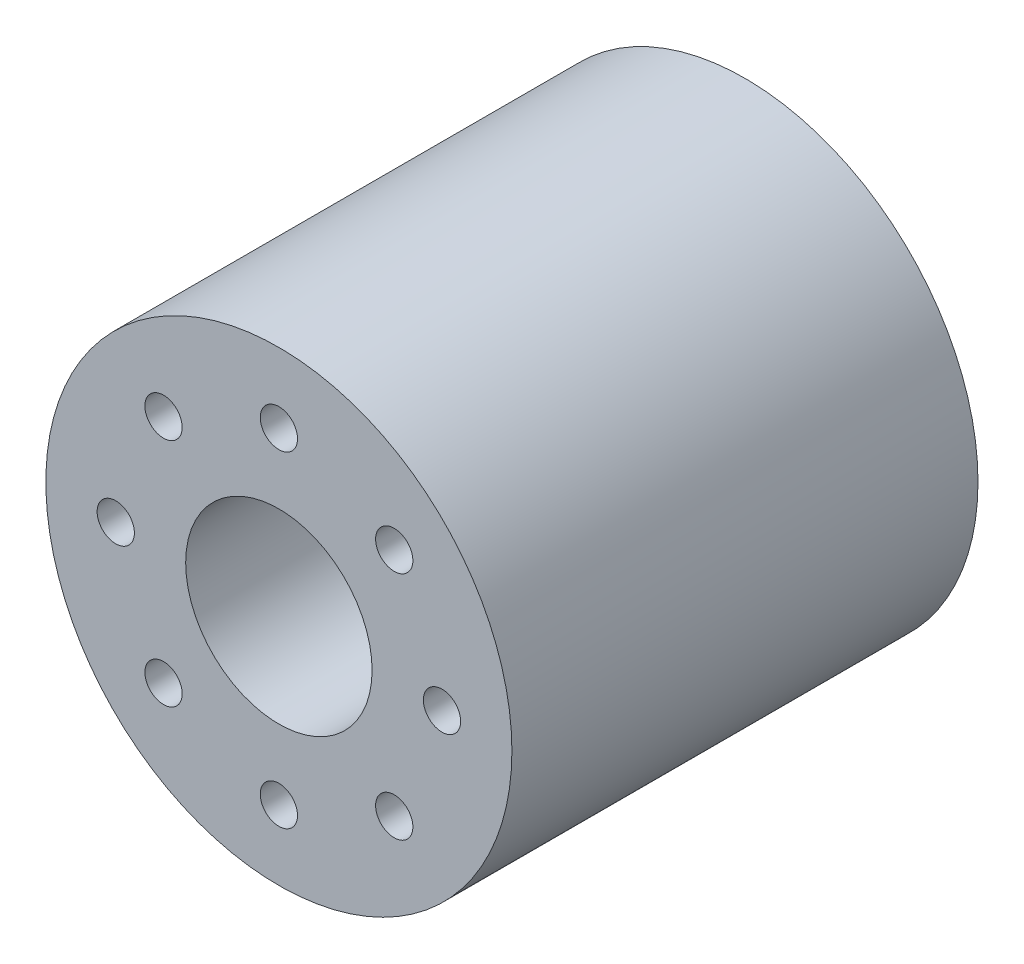
ISO-10303-21;
HEADER;
FILE_DESCRIPTION(('STEP AP214'),'2;1');
FILE_NAME('part.step','',(''),(''),'','','');
FILE_SCHEMA(('AUTOMOTIVE_DESIGN { 1 0 10303 214 1 1 1 1 }'));
ENDSEC;
DATA;
#1=APPLICATION_CONTEXT('core data for automotive mechanical design processes');
#2=APPLICATION_PROTOCOL_DEFINITION('international standard','automotive_design',2000,#1);
#3=PRODUCT_CONTEXT('',#1,'mechanical');
#4=PRODUCT('Part','Part','',(#3));
#5=PRODUCT_RELATED_PRODUCT_CATEGORY('part','',(#4));
#6=PRODUCT_DEFINITION_FORMATION('','',#4);
#7=PRODUCT_DEFINITION_CONTEXT('part definition',#1,'design');
#8=PRODUCT_DEFINITION('design','',#6,#7);
#9=PRODUCT_DEFINITION_SHAPE('','',#8);
#10=(LENGTH_UNIT() NAMED_UNIT(*) SI_UNIT(.MILLI.,.METRE.));
#11=(NAMED_UNIT(*) PLANE_ANGLE_UNIT() SI_UNIT($,.RADIAN.));
#12=(NAMED_UNIT(*) SI_UNIT($,.STERADIAN.) SOLID_ANGLE_UNIT());
#13=UNCERTAINTY_MEASURE_WITH_UNIT(LENGTH_MEASURE(1.E-05),#10,'distance_accuracy_value','');
#14=(GEOMETRIC_REPRESENTATION_CONTEXT(3) GLOBAL_UNCERTAINTY_ASSIGNED_CONTEXT((#13)) GLOBAL_UNIT_ASSIGNED_CONTEXT((#10,
#11,#12)) REPRESENTATION_CONTEXT('',''));
#15=CARTESIAN_POINT('',(0.,0.,0.));
#16=DIRECTION('',(0.,0.,1.));
#17=DIRECTION('',(1.,0.,0.));
#18=AXIS2_PLACEMENT_3D('',#15,#16,#17);
#19=CARTESIAN_POINT('',(0.,0.,25.));
#20=DIRECTION('',(0.,0.,1.));
#21=DIRECTION('',(1.,0.,0.));
#22=AXIS2_PLACEMENT_3D('',#19,#20,#21);
#23=PLANE('',#22);
#24=CARTESIAN_POINT('',(0.,8.75,25.));
#25=DIRECTION('',(0.,0.,1.));
#26=DIRECTION('',(1.,0.,0.));
#27=AXIS2_PLACEMENT_3D('',#24,#25,#26);
#28=CIRCLE('',#27,1.);
#29=CARTESIAN_POINT('',(1.,8.75,25.));
#30=VERTEX_POINT('',#29);
#31=EDGE_CURVE('E92',#30,#30,#28,.T.);
#32=ORIENTED_EDGE('',*,*,#31,.F.);
#33=EDGE_LOOP('',(#32));
#34=FACE_BOUND('',#33,.T.);
#35=CARTESIAN_POINT('',(6.1871843353824,6.18718433538255,25.));
#36=DIRECTION('',(0.,0.,1.));
#37=DIRECTION('',(1.,0.,0.));
#38=AXIS2_PLACEMENT_3D('',#35,#36,#37);
#39=CIRCLE('',#38,1.00000000000004);
#40=CARTESIAN_POINT('',(7.18718433538244,6.18718433538255,25.));
#41=VERTEX_POINT('',#40);
#42=EDGE_CURVE('E86',#41,#41,#39,.T.);
#43=ORIENTED_EDGE('',*,*,#42,.F.);
#44=EDGE_LOOP('',(#43));
#45=FACE_BOUND('',#44,.T.);
#46=CARTESIAN_POINT('',(8.75000000000037,3.71427587350172E-13,25.));
#47=DIRECTION('',(0.,0.,1.));
#48=DIRECTION('',(1.,0.,0.));
#49=AXIS2_PLACEMENT_3D('',#46,#47,#48);
#50=CIRCLE('',#49,1.00000000000028);
#51=CARTESIAN_POINT('',(9.75000000000065,3.71427587350172E-13,25.));
#52=VERTEX_POINT('',#51);
#53=EDGE_CURVE('E80',#52,#52,#50,.T.);
#54=ORIENTED_EDGE('',*,*,#53,.F.);
#55=EDGE_LOOP('',(#54));
#56=FACE_BOUND('',#55,.T.);
#57=CARTESIAN_POINT('',(6.18718433538292,-6.18718433538203,25.));
#58=DIRECTION('',(0.,0.,1.));
#59=DIRECTION('',(1.,0.,0.));
#60=AXIS2_PLACEMENT_3D('',#57,#58,#59);
#61=CIRCLE('',#60,1.00000000000057);
#62=CARTESIAN_POINT('',(7.1871843353835,-6.18718433538203,25.));
#63=VERTEX_POINT('',#62);
#64=EDGE_CURVE('E74',#63,#63,#61,.T.);
#65=ORIENTED_EDGE('',*,*,#64,.F.);
#66=EDGE_LOOP('',(#65));
#67=FACE_BOUND('',#66,.T.);
#68=CARTESIAN_POINT('',(7.42855174700344E-13,-8.75,25.));
#69=DIRECTION('',(0.,0.,1.));
#70=DIRECTION('',(1.,0.,0.));
#71=AXIS2_PLACEMENT_3D('',#68,#69,#70);
#72=CIRCLE('',#71,1.00000000000077);
#73=CARTESIAN_POINT('',(1.00000000000151,-8.75,25.));
#74=VERTEX_POINT('',#73);
#75=EDGE_CURVE('E68',#74,#74,#72,.T.);
#76=ORIENTED_EDGE('',*,*,#75,.F.);
#77=EDGE_LOOP('',(#76));
#78=FACE_BOUND('',#77,.T.);
#79=CARTESIAN_POINT('',(-6.18718433538166,-6.18718433538255,25.));
#80=DIRECTION('',(0.,0.,1.));
#81=DIRECTION('',(1.,0.,0.));
#82=AXIS2_PLACEMENT_3D('',#79,#80,#81);
#83=CIRCLE('',#82,1.00000000000076);
#84=CARTESIAN_POINT('',(-5.1871843353809,-6.18718433538255,25.));
#85=VERTEX_POINT('',#84);
#86=EDGE_CURVE('E62',#85,#85,#83,.T.);
#87=ORIENTED_EDGE('',*,*,#86,.F.);
#88=EDGE_LOOP('',(#87));
#89=FACE_BOUND('',#88,.T.);
#90=CARTESIAN_POINT('',(-8.74999999999963,-3.72499153299426E-13,25.));
#91=DIRECTION('',(0.,0.,1.));
#92=DIRECTION('',(1.,0.,0.));
#93=AXIS2_PLACEMENT_3D('',#90,#91,#92);
#94=CIRCLE('',#93,1.00000000000055);
#95=CARTESIAN_POINT('',(-7.74999999999908,-3.72499153299426E-13,25.));
#96=VERTEX_POINT('',#95);
#97=EDGE_CURVE('E56',#96,#96,#94,.T.);
#98=ORIENTED_EDGE('',*,*,#97,.F.);
#99=EDGE_LOOP('',(#98));
#100=FACE_BOUND('',#99,.T.);
#101=CARTESIAN_POINT('',(-6.18718433538218,6.18718433538203,25.));
#102=DIRECTION('',(0.,0.,1.));
#103=DIRECTION('',(1.,0.,0.));
#104=AXIS2_PLACEMENT_3D('',#101,#102,#103);
#105=CIRCLE('',#104,1.00000000000029);
#106=CARTESIAN_POINT('',(-5.1871843353819,6.18718433538203,25.));
#107=VERTEX_POINT('',#106);
#108=EDGE_CURVE('E50',#107,#107,#105,.T.);
#109=ORIENTED_EDGE('',*,*,#108,.F.);
#110=EDGE_LOOP('',(#109));
#111=FACE_BOUND('',#110,.T.);
#112=CARTESIAN_POINT('',(0.,0.,25.));
#113=DIRECTION('',(0.,0.,1.));
#114=DIRECTION('',(1.,0.,0.));
#115=AXIS2_PLACEMENT_3D('',#112,#113,#114);
#116=CIRCLE('',#115,12.5);
#117=CARTESIAN_POINT('',(12.5,0.,25.));
#118=VERTEX_POINT('',#117);
#119=EDGE_CURVE('E10',#118,#118,#116,.T.);
#120=ORIENTED_EDGE('',*,*,#119,.T.);
#121=EDGE_LOOP('',(#120));
#122=FACE_BOUND('',#121,.T.);
#123=CARTESIAN_POINT('',(0.,0.,25.));
#124=DIRECTION('',(0.,0.,1.));
#125=DIRECTION('',(1.,0.,0.));
#126=AXIS2_PLACEMENT_3D('',#123,#124,#125);
#127=CIRCLE('',#126,5.);
#128=CARTESIAN_POINT('',(5.,0.,25.));
#129=VERTEX_POINT('',#128);
#130=EDGE_CURVE('E42',#129,#129,#127,.T.);
#131=ORIENTED_EDGE('',*,*,#130,.F.);
#132=EDGE_LOOP('',(#131));
#133=FACE_BOUND('',#132,.T.);
#134=ADVANCED_FACE('F31',(#34,#45,#56,#67,#78,#89,#100,#111,#122,#133),#23,.T.);
#135=CARTESIAN_POINT('',(0.,0.,0.));
#136=DIRECTION('',(0.,0.,1.));
#137=DIRECTION('',(1.,0.,0.));
#138=AXIS2_PLACEMENT_3D('',#135,#136,#137);
#139=PLANE('',#138);
#140=CARTESIAN_POINT('',(0.,8.75,0.));
#141=DIRECTION('',(0.,0.,1.));
#142=DIRECTION('',(1.,0.,0.));
#143=AXIS2_PLACEMENT_3D('',#140,#141,#142);
#144=CIRCLE('',#143,1.);
#145=CARTESIAN_POINT('',(1.,8.75,0.));
#146=VERTEX_POINT('',#145);
#147=EDGE_CURVE('E47',#146,#146,#144,.T.);
#148=ORIENTED_EDGE('',*,*,#147,.T.);
#149=EDGE_LOOP('',(#148));
#150=FACE_BOUND('',#149,.T.);
#151=CARTESIAN_POINT('',(6.1871843353824,6.18718433538255,0.));
#152=DIRECTION('',(0.,0.,1.));
#153=DIRECTION('',(1.,0.,0.));
#154=AXIS2_PLACEMENT_3D('',#151,#152,#153);
#155=CIRCLE('',#154,1.00000000000004);
#156=CARTESIAN_POINT('',(7.18718433538244,6.18718433538255,0.));
#157=VERTEX_POINT('',#156);
#158=EDGE_CURVE('E89',#157,#157,#155,.T.);
#159=ORIENTED_EDGE('',*,*,#158,.T.);
#160=EDGE_LOOP('',(#159));
#161=FACE_BOUND('',#160,.T.);
#162=CARTESIAN_POINT('',(8.75000000000037,3.71427587350172E-13,0.));
#163=DIRECTION('',(0.,0.,1.));
#164=DIRECTION('',(1.,0.,0.));
#165=AXIS2_PLACEMENT_3D('',#162,#163,#164);
#166=CIRCLE('',#165,1.00000000000028);
#167=CARTESIAN_POINT('',(9.75000000000065,3.71427587350172E-13,0.));
#168=VERTEX_POINT('',#167);
#169=EDGE_CURVE('E83',#168,#168,#166,.T.);
#170=ORIENTED_EDGE('',*,*,#169,.T.);
#171=EDGE_LOOP('',(#170));
#172=FACE_BOUND('',#171,.T.);
#173=CARTESIAN_POINT('',(6.18718433538292,-6.18718433538203,0.));
#174=DIRECTION('',(0.,0.,1.));
#175=DIRECTION('',(1.,0.,0.));
#176=AXIS2_PLACEMENT_3D('',#173,#174,#175);
#177=CIRCLE('',#176,1.00000000000057);
#178=CARTESIAN_POINT('',(7.1871843353835,-6.18718433538203,0.));
#179=VERTEX_POINT('',#178);
#180=EDGE_CURVE('E77',#179,#179,#177,.T.);
#181=ORIENTED_EDGE('',*,*,#180,.T.);
#182=EDGE_LOOP('',(#181));
#183=FACE_BOUND('',#182,.T.);
#184=CARTESIAN_POINT('',(7.42855174700344E-13,-8.75,0.));
#185=DIRECTION('',(0.,0.,1.));
#186=DIRECTION('',(1.,0.,0.));
#187=AXIS2_PLACEMENT_3D('',#184,#185,#186);
#188=CIRCLE('',#187,1.00000000000077);
#189=CARTESIAN_POINT('',(1.00000000000151,-8.75,0.));
#190=VERTEX_POINT('',#189);
#191=EDGE_CURVE('E71',#190,#190,#188,.T.);
#192=ORIENTED_EDGE('',*,*,#191,.T.);
#193=EDGE_LOOP('',(#192));
#194=FACE_BOUND('',#193,.T.);
#195=CARTESIAN_POINT('',(-6.18718433538166,-6.18718433538255,0.));
#196=DIRECTION('',(0.,0.,1.));
#197=DIRECTION('',(1.,0.,0.));
#198=AXIS2_PLACEMENT_3D('',#195,#196,#197);
#199=CIRCLE('',#198,1.00000000000076);
#200=CARTESIAN_POINT('',(-5.1871843353809,-6.18718433538255,0.));
#201=VERTEX_POINT('',#200);
#202=EDGE_CURVE('E65',#201,#201,#199,.T.);
#203=ORIENTED_EDGE('',*,*,#202,.T.);
#204=EDGE_LOOP('',(#203));
#205=FACE_BOUND('',#204,.T.);
#206=CARTESIAN_POINT('',(-8.74999999999963,-3.72499153299426E-13,0.));
#207=DIRECTION('',(0.,0.,1.));
#208=DIRECTION('',(1.,0.,0.));
#209=AXIS2_PLACEMENT_3D('',#206,#207,#208);
#210=CIRCLE('',#209,1.00000000000055);
#211=CARTESIAN_POINT('',(-7.74999999999908,-3.72499153299426E-13,0.));
#212=VERTEX_POINT('',#211);
#213=EDGE_CURVE('E59',#212,#212,#210,.T.);
#214=ORIENTED_EDGE('',*,*,#213,.T.);
#215=EDGE_LOOP('',(#214));
#216=FACE_BOUND('',#215,.T.);
#217=CARTESIAN_POINT('',(-6.18718433538218,6.18718433538203,0.));
#218=DIRECTION('',(0.,0.,1.));
#219=DIRECTION('',(1.,0.,0.));
#220=AXIS2_PLACEMENT_3D('',#217,#218,#219);
#221=CIRCLE('',#220,1.00000000000029);
#222=CARTESIAN_POINT('',(-5.1871843353819,6.18718433538203,0.));
#223=VERTEX_POINT('',#222);
#224=EDGE_CURVE('E53',#223,#223,#221,.T.);
#225=ORIENTED_EDGE('',*,*,#224,.T.);
#226=EDGE_LOOP('',(#225));
#227=FACE_BOUND('',#226,.T.);
#228=CARTESIAN_POINT('',(0.,0.,0.));
#229=DIRECTION('',(0.,0.,1.));
#230=DIRECTION('',(1.,0.,0.));
#231=AXIS2_PLACEMENT_3D('',#228,#229,#230);
#232=CIRCLE('',#231,12.5);
#233=CARTESIAN_POINT('',(12.5,0.,0.));
#234=VERTEX_POINT('',#233);
#235=EDGE_CURVE('E35',#234,#234,#232,.T.);
#236=ORIENTED_EDGE('',*,*,#235,.F.);
#237=EDGE_LOOP('',(#236));
#238=FACE_BOUND('',#237,.T.);
#239=CARTESIAN_POINT('',(0.,0.,0.));
#240=DIRECTION('',(0.,0.,1.));
#241=DIRECTION('',(1.,0.,0.));
#242=AXIS2_PLACEMENT_3D('',#239,#240,#241);
#243=CIRCLE('',#242,5.);
#244=CARTESIAN_POINT('',(5.,0.,0.));
#245=VERTEX_POINT('',#244);
#246=EDGE_CURVE('E44',#245,#245,#243,.T.);
#247=ORIENTED_EDGE('',*,*,#246,.T.);
#248=EDGE_LOOP('',(#247));
#249=FACE_BOUND('',#248,.T.);
#250=ADVANCED_FACE('F98',(#150,#161,#172,#183,#194,#205,#216,#227,#238,#249),#139,.F.);
#251=CARTESIAN_POINT('',(0.,0.,25.));
#252=DIRECTION('',(0.,0.,-1.));
#253=DIRECTION('',(-1.,0.,0.));
#254=AXIS2_PLACEMENT_3D('',#251,#252,#253);
#255=CYLINDRICAL_SURFACE('',#254,12.5);
#256=ORIENTED_EDGE('',*,*,#119,.F.);
#257=EDGE_LOOP('',(#256));
#258=FACE_BOUND('',#257,.T.);
#259=ORIENTED_EDGE('',*,*,#235,.T.);
#260=EDGE_LOOP('',(#259));
#261=FACE_BOUND('',#260,.T.);
#262=ADVANCED_FACE('F33',(#258,#261),#255,.T.);
#263=CARTESIAN_POINT('',(0.,0.,25.));
#264=DIRECTION('',(0.,0.,-1.));
#265=DIRECTION('',(-1.,0.,0.));
#266=AXIS2_PLACEMENT_3D('',#263,#264,#265);
#267=CYLINDRICAL_SURFACE('',#266,5.);
#268=ORIENTED_EDGE('',*,*,#130,.T.);
#269=EDGE_LOOP('',(#268));
#270=FACE_BOUND('',#269,.T.);
#271=ORIENTED_EDGE('',*,*,#246,.F.);
#272=EDGE_LOOP('',(#271));
#273=FACE_BOUND('',#272,.T.);
#274=ADVANCED_FACE('F127',(#270,#273),#267,.F.);
#275=CARTESIAN_POINT('',(-6.18718433538218,6.18718433538203,0.));
#276=DIRECTION('',(0.,0.,1.));
#277=DIRECTION('',(1.,0.,0.));
#278=AXIS2_PLACEMENT_3D('',#275,#276,#277);
#279=CYLINDRICAL_SURFACE('',#278,1.00000000000029);
#280=ORIENTED_EDGE('',*,*,#224,.F.);
#281=EDGE_LOOP('',(#280));
#282=FACE_BOUND('',#281,.T.);
#283=ORIENTED_EDGE('',*,*,#108,.T.);
#284=EDGE_LOOP('',(#283));
#285=FACE_BOUND('',#284,.T.);
#286=ADVANCED_FACE('F130',(#282,#285),#279,.F.);
#287=CARTESIAN_POINT('',(-8.74999999999963,-3.72499153299426E-13,0.));
#288=DIRECTION('',(0.,0.,1.));
#289=DIRECTION('',(1.,0.,0.));
#290=AXIS2_PLACEMENT_3D('',#287,#288,#289);
#291=CYLINDRICAL_SURFACE('',#290,1.00000000000055);
#292=ORIENTED_EDGE('',*,*,#213,.F.);
#293=EDGE_LOOP('',(#292));
#294=FACE_BOUND('',#293,.T.);
#295=ORIENTED_EDGE('',*,*,#97,.T.);
#296=EDGE_LOOP('',(#295));
#297=FACE_BOUND('',#296,.T.);
#298=ADVANCED_FACE('F142',(#294,#297),#291,.F.);
#299=CARTESIAN_POINT('',(-6.18718433538166,-6.18718433538255,0.));
#300=DIRECTION('',(0.,0.,1.));
#301=DIRECTION('',(1.,0.,0.));
#302=AXIS2_PLACEMENT_3D('',#299,#300,#301);
#303=CYLINDRICAL_SURFACE('',#302,1.00000000000076);
#304=ORIENTED_EDGE('',*,*,#202,.F.);
#305=EDGE_LOOP('',(#304));
#306=FACE_BOUND('',#305,.T.);
#307=ORIENTED_EDGE('',*,*,#86,.T.);
#308=EDGE_LOOP('',(#307));
#309=FACE_BOUND('',#308,.T.);
#310=ADVANCED_FACE('F146',(#306,#309),#303,.F.);
#311=CARTESIAN_POINT('',(7.42855174700344E-13,-8.75,0.));
#312=DIRECTION('',(0.,0.,1.));
#313=DIRECTION('',(1.,0.,0.));
#314=AXIS2_PLACEMENT_3D('',#311,#312,#313);
#315=CYLINDRICAL_SURFACE('',#314,1.00000000000077);
#316=ORIENTED_EDGE('',*,*,#191,.F.);
#317=EDGE_LOOP('',(#316));
#318=FACE_BOUND('',#317,.T.);
#319=ORIENTED_EDGE('',*,*,#75,.T.);
#320=EDGE_LOOP('',(#319));
#321=FACE_BOUND('',#320,.T.);
#322=ADVANCED_FACE('F150',(#318,#321),#315,.F.);
#323=CARTESIAN_POINT('',(6.18718433538292,-6.18718433538203,0.));
#324=DIRECTION('',(0.,0.,1.));
#325=DIRECTION('',(1.,0.,0.));
#326=AXIS2_PLACEMENT_3D('',#323,#324,#325);
#327=CYLINDRICAL_SURFACE('',#326,1.00000000000057);
#328=ORIENTED_EDGE('',*,*,#180,.F.);
#329=EDGE_LOOP('',(#328));
#330=FACE_BOUND('',#329,.T.);
#331=ORIENTED_EDGE('',*,*,#64,.T.);
#332=EDGE_LOOP('',(#331));
#333=FACE_BOUND('',#332,.T.);
#334=ADVANCED_FACE('F154',(#330,#333),#327,.F.);
#335=CARTESIAN_POINT('',(8.75000000000037,3.71427587350172E-13,0.));
#336=DIRECTION('',(0.,0.,1.));
#337=DIRECTION('',(1.,0.,0.));
#338=AXIS2_PLACEMENT_3D('',#335,#336,#337);
#339=CYLINDRICAL_SURFACE('',#338,1.00000000000028);
#340=ORIENTED_EDGE('',*,*,#169,.F.);
#341=EDGE_LOOP('',(#340));
#342=FACE_BOUND('',#341,.T.);
#343=ORIENTED_EDGE('',*,*,#53,.T.);
#344=EDGE_LOOP('',(#343));
#345=FACE_BOUND('',#344,.T.);
#346=ADVANCED_FACE('F158',(#342,#345),#339,.F.);
#347=CARTESIAN_POINT('',(6.1871843353824,6.18718433538255,0.));
#348=DIRECTION('',(0.,0.,1.));
#349=DIRECTION('',(1.,0.,0.));
#350=AXIS2_PLACEMENT_3D('',#347,#348,#349);
#351=CYLINDRICAL_SURFACE('',#350,1.00000000000004);
#352=ORIENTED_EDGE('',*,*,#158,.F.);
#353=EDGE_LOOP('',(#352));
#354=FACE_BOUND('',#353,.T.);
#355=ORIENTED_EDGE('',*,*,#42,.T.);
#356=EDGE_LOOP('',(#355));
#357=FACE_BOUND('',#356,.T.);
#358=ADVANCED_FACE('F104',(#354,#357),#351,.F.);
#359=CARTESIAN_POINT('',(0.,8.75,0.));
#360=DIRECTION('',(0.,0.,1.));
#361=DIRECTION('',(1.,0.,0.));
#362=AXIS2_PLACEMENT_3D('',#359,#360,#361);
#363=CYLINDRICAL_SURFACE('',#362,1.);
#364=ORIENTED_EDGE('',*,*,#147,.F.);
#365=EDGE_LOOP('',(#364));
#366=FACE_BOUND('',#365,.T.);
#367=ORIENTED_EDGE('',*,*,#31,.T.);
#368=EDGE_LOOP('',(#367));
#369=FACE_BOUND('',#368,.T.);
#370=ADVANCED_FACE('F101',(#366,#369),#363,.F.);
#371=CLOSED_SHELL('',(#134,#250,#262,#274,#286,#298,#310,#322,#334,#346,#358,#370));
#372=MANIFOLD_SOLID_BREP('B2',#371);
#373=ADVANCED_BREP_SHAPE_REPRESENTATION('',(#18,#372),#14);
#374=SHAPE_DEFINITION_REPRESENTATION(#9,#373);
ENDSEC;
END-ISO-10303-21;
